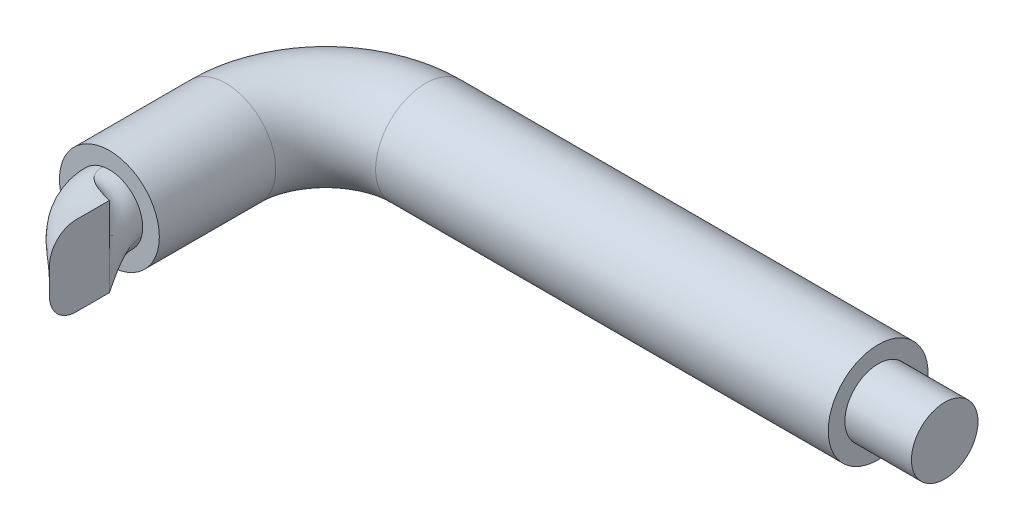
ISO-10303-21;
HEADER;
FILE_DESCRIPTION(('STEP AP214'),'2;1');
FILE_NAME('part.step','',(''),(''),'','','');
FILE_SCHEMA(('AUTOMOTIVE_DESIGN { 1 0 10303 214 1 1 1 1 }'));
ENDSEC;
DATA;
#1=APPLICATION_CONTEXT('core data for automotive mechanical design processes');
#2=APPLICATION_PROTOCOL_DEFINITION('international standard','automotive_design',2000,#1);
#3=PRODUCT_CONTEXT('',#1,'mechanical');
#4=PRODUCT('Part','Part','',(#3));
#5=PRODUCT_RELATED_PRODUCT_CATEGORY('part','',(#4));
#6=PRODUCT_DEFINITION_FORMATION('','',#4);
#7=PRODUCT_DEFINITION_CONTEXT('part definition',#1,'design');
#8=PRODUCT_DEFINITION('design','',#6,#7);
#9=PRODUCT_DEFINITION_SHAPE('','',#8);
#10=(LENGTH_UNIT() NAMED_UNIT(*) SI_UNIT(.MILLI.,.METRE.));
#11=(NAMED_UNIT(*) PLANE_ANGLE_UNIT() SI_UNIT($,.RADIAN.));
#12=(NAMED_UNIT(*) SI_UNIT($,.STERADIAN.) SOLID_ANGLE_UNIT());
#13=UNCERTAINTY_MEASURE_WITH_UNIT(LENGTH_MEASURE(1.E-05),#10,'distance_accuracy_value','');
#14=(GEOMETRIC_REPRESENTATION_CONTEXT(3) GLOBAL_UNCERTAINTY_ASSIGNED_CONTEXT((#13)) GLOBAL_UNIT_ASSIGNED_CONTEXT((#10,
#11,#12)) REPRESENTATION_CONTEXT('',''));
#15=CARTESIAN_POINT('',(0.,0.,0.));
#16=DIRECTION('',(0.,0.,1.));
#17=DIRECTION('',(1.,0.,0.));
#18=AXIS2_PLACEMENT_3D('',#15,#16,#17);
#19=CARTESIAN_POINT('',(0.,0.,0.));
#20=DIRECTION('',(0.,0.,1.));
#21=DIRECTION('',(1.,0.,0.));
#22=AXIS2_PLACEMENT_3D('',#19,#20,#21);
#23=PLANE('',#22);
#24=CARTESIAN_POINT('',(0.,0.,0.));
#25=DIRECTION('',(0.,0.,1.));
#26=DIRECTION('',(1.,0.,0.));
#27=AXIS2_PLACEMENT_3D('',#24,#25,#26);
#28=CIRCLE('',#27,1.5);
#29=CARTESIAN_POINT('',(1.5,0.,0.));
#30=VERTEX_POINT('',#29);
#31=EDGE_CURVE('E327',#30,#30,#28,.T.);
#32=ORIENTED_EDGE('',*,*,#31,.T.);
#33=EDGE_LOOP('',(#32));
#34=FACE_BOUND('',#33,.T.);
#35=CARTESIAN_POINT('',(0.,0.,0.));
#36=DIRECTION('',(0.,0.,1.));
#37=DIRECTION('',(1.,0.,0.));
#38=AXIS2_PLACEMENT_3D('',#35,#36,#37);
#39=CIRCLE('',#38,1.);
#40=CARTESIAN_POINT('',(-0.196014603582893,0.980600976535431,0.));
#41=VERTEX_POINT('',#40);
#42=CARTESIAN_POINT('',(0.968273614060441,-0.249892393470332,0.));
#43=VERTEX_POINT('',#42);
#44=EDGE_CURVE('E222',#41,#43,#39,.T.);
#45=ORIENTED_EDGE('',*,*,#44,.F.);
#46=CARTESIAN_POINT('',(0.968273614060441,-0.249892393470332,0.));
#47=CARTESIAN_POINT('',(0.975401751704675,-0.222277290418172,0.));
#48=CARTESIAN_POINT('',(0.981378344294026,-0.194376502746998,0.));
#49=CARTESIAN_POINT('',(0.990959635482259,-0.13816611327387,0.));
#50=CARTESIAN_POINT('',(0.994563916211097,-0.109856440345965,0.));
#51=CARTESIAN_POINT('',(1.00169674255544,-0.0247533128585314,0.));
#52=CARTESIAN_POINT('',(1.0015913815013,0.0323917667388428,0.));
#53=CARTESIAN_POINT('',(0.991533411556463,0.145179209531626,0.));
#54=CARTESIAN_POINT('',(0.981683812776769,0.200831038692795,0.));
#55=CARTESIAN_POINT('',(0.952647257426055,0.309656022599184,0.));
#56=CARTESIAN_POINT('',(0.933457042564117,0.362828305305481,0.));
#57=CARTESIAN_POINT('',(0.886807600630729,0.464866963932581,0.));
#58=CARTESIAN_POINT('',(0.859417356060065,0.513765027469147,0.));
#59=CARTESIAN_POINT('',(0.796956305830027,0.606389194046122,0.));
#60=CARTESIAN_POINT('',(0.761888118358517,0.650117052323781,0.));
#61=CARTESIAN_POINT('',(0.684302904771817,0.731378232435368,0.));
#62=CARTESIAN_POINT('',(0.641702453889153,0.768831920784329,0.));
#63=CARTESIAN_POINT('',(0.550878231866113,0.836146963445934,0.));
#64=CARTESIAN_POINT('',(0.502652190662811,0.86600523725766,0.));
#65=CARTESIAN_POINT('',(0.401859065984796,0.917389295403562,0.));
#66=CARTESIAN_POINT('',(0.349287000313928,0.938905351065081,0.));
#67=CARTESIAN_POINT('',(0.241244872588478,0.972588469933583,0.));
#68=CARTESIAN_POINT('',(0.185776137831459,0.984759775590992,0.));
#69=CARTESIAN_POINT('',(0.075602212889256,0.999107115314082,0.));
#70=CARTESIAN_POINT('',(0.0209427256883897,1.00163085675871,0.));
#71=CARTESIAN_POINT('',(-0.0607982462033383,0.998715930621456,0.));
#72=CARTESIAN_POINT('',(-0.0880385834828392,0.996620536571416,0.));
#73=CARTESIAN_POINT('',(-0.14225877235282,0.990239633691644,0.));
#74=CARTESIAN_POINT('',(-0.169238654137037,0.985954381908235,0.));
#75=CARTESIAN_POINT('',(-0.196014603582894,0.980600976535431,0.));
#76=B_SPLINE_CURVE_WITH_KNOTS('',3,(#46,#47,#48,#49,#50,#51,#52,#53,#54,#55,#56,#57,#58,#59,#60,
#61,#62,#63,#64,#65,#66,#67,#68,#69,#70,#71,#72,#73,#74,#75),.UNSPECIFIED.,.F.,.F.,(4,2,2,2,2,2,
2,2,2,2,2,2,2,2,4),(0.,0.0855119962023879,0.171039050857386,0.341550072552126,0.510277611785777,
0.679064050542799,0.84646867728225,1.01381630750406,1.18314904021408,1.352550340736,
1.52214860662187,1.69166983049049,1.85502037040864,1.93690562876398,2.018781277604),.UNSPECIFIED.);
#77=EDGE_CURVE('E192',#43,#41,#76,.T.);
#78=ORIENTED_EDGE('',*,*,#77,.F.);
#79=EDGE_LOOP('',(#45,#78));
#80=FACE_BOUND('',#79,.T.);
#81=ADVANCED_FACE('F174',(#34,#80),#23,.T.);
#82=CARTESIAN_POINT('',(16.6,0.,-6.5));
#83=DIRECTION('',(-1.,0.,0.));
#84=DIRECTION('',(0.,0.,1.));
#85=AXIS2_PLACEMENT_3D('',#82,#83,#84);
#86=PLANE('',#85);
#87=CARTESIAN_POINT('',(16.6,0.,-6.5));
#88=DIRECTION('',(1.,0.,0.));
#89=DIRECTION('',(0.,0.,-1.));
#90=AXIS2_PLACEMENT_3D('',#87,#88,#89);
#91=CIRCLE('',#90,1.);
#92=CARTESIAN_POINT('',(16.6,0.,-7.5));
#93=VERTEX_POINT('',#92);
#94=EDGE_CURVE('E12',#93,#93,#91,.T.);
#95=ORIENTED_EDGE('',*,*,#94,.F.);
#96=EDGE_LOOP('',(#95));
#97=FACE_BOUND('',#96,.T.);
#98=CARTESIAN_POINT('',(16.6,0.,-6.5));
#99=DIRECTION('',(-1.,0.,0.));
#100=DIRECTION('',(0.,0.,1.));
#101=AXIS2_PLACEMENT_3D('',#98,#99,#100);
#102=CIRCLE('',#101,1.5);
#103=CARTESIAN_POINT('',(16.6,0.,-5.));
#104=VERTEX_POINT('',#103);
#105=EDGE_CURVE('E184',#104,#104,#102,.T.);
#106=ORIENTED_EDGE('',*,*,#105,.F.);
#107=EDGE_LOOP('',(#106));
#108=FACE_BOUND('',#107,.T.);
#109=ADVANCED_FACE('F392',(#97,#108),#86,.F.);
#110=CARTESIAN_POINT('',(0.,0.,0.));
#111=DIRECTION('',(0.,0.,-1.));
#112=DIRECTION('',(-1.,0.,0.));
#113=AXIS2_PLACEMENT_3D('',#110,#111,#112);
#114=CYLINDRICAL_SURFACE('',#113,1.5);
#115=CARTESIAN_POINT('',(0.,0.,-3.5));
#116=DIRECTION('',(0.,0.,1.));
#117=DIRECTION('',(1.,0.,0.));
#118=AXIS2_PLACEMENT_3D('',#115,#116,#117);
#119=CIRCLE('',#118,1.5);
#120=CARTESIAN_POINT('',(-1.5,0.,-3.5));
#121=VERTEX_POINT('',#120);
#122=EDGE_CURVE('E377',#121,#121,#119,.T.);
#123=ORIENTED_EDGE('',*,*,#122,.T.);
#124=EDGE_LOOP('',(#123));
#125=FACE_BOUND('',#124,.T.);
#126=ORIENTED_EDGE('',*,*,#31,.F.);
#127=EDGE_LOOP('',(#126));
#128=FACE_BOUND('',#127,.T.);
#129=ADVANCED_FACE('F394',(#125,#128),#114,.T.);
#130=CARTESIAN_POINT('',(3.,0.,-3.5));
#131=DIRECTION('',(0.,-1.,0.));
#132=DIRECTION('',(0.,0.,-1.));
#133=AXIS2_PLACEMENT_3D('',#130,#131,#132);
#134=TOROIDAL_SURFACE('',#133,3.,1.5);
#135=CARTESIAN_POINT('',(3.,0.,-6.5));
#136=DIRECTION('',(-1.,0.,0.));
#137=DIRECTION('',(0.,0.,1.));
#138=AXIS2_PLACEMENT_3D('',#135,#136,#137);
#139=CIRCLE('',#138,1.5);
#140=CARTESIAN_POINT('',(3.,0.,-8.));
#141=VERTEX_POINT('',#140);
#142=EDGE_CURVE('E380',#141,#141,#139,.T.);
#143=CARTESIAN_POINT('',(3.,0.,-3.5));
#144=DIRECTION('',(0.,-1.,0.));
#145=DIRECTION('',(0.,0.,-1.));
#146=AXIS2_PLACEMENT_3D('',#143,#144,#145);
#147=CIRCLE('',#146,4.5);
#148=EDGE_CURVE('',#121,#141,#147,.T.);
#149=ORIENTED_EDGE('',*,*,#122,.F.);
#150=ORIENTED_EDGE('',*,*,#142,.T.);
#151=ORIENTED_EDGE('',*,*,#148,.T.);
#152=ORIENTED_EDGE('',*,*,#148,.F.);
#153=EDGE_LOOP('',(#149,#151,#150,#152));
#154=FACE_BOUND('',#153,.T.);
#155=ADVANCED_FACE('F400',(#154),#134,.T.);
#156=CARTESIAN_POINT('',(3.,0.,-6.5));
#157=DIRECTION('',(1.,0.,0.));
#158=DIRECTION('',(0.,0.,-1.));
#159=AXIS2_PLACEMENT_3D('',#156,#157,#158);
#160=CYLINDRICAL_SURFACE('',#159,1.5);
#161=ORIENTED_EDGE('',*,*,#105,.T.);
#162=EDGE_LOOP('',(#161));
#163=FACE_BOUND('',#162,.T.);
#164=ORIENTED_EDGE('',*,*,#142,.F.);
#165=EDGE_LOOP('',(#164));
#166=FACE_BOUND('',#165,.T.);
#167=ADVANCED_FACE('F389',(#163,#166),#160,.T.);
#168=CARTESIAN_POINT('',(1.,-0.400000000000001,2.));
#169=DIRECTION('',(-1.,0.,0.));
#170=DIRECTION('',(0.,0.,1.));
#171=AXIS2_PLACEMENT_3D('',#168,#169,#170);
#172=PLANE('',#171);
#173=CARTESIAN_POINT('',(1.,-0.400000000000001,2.));
#174=DIRECTION('',(1.,0.,0.));
#175=DIRECTION('',(0.,0.,1.));
#176=AXIS2_PLACEMENT_3D('',#173,#174,#175);
#177=CIRCLE('',#176,0.8);
#178=CARTESIAN_POINT('',(1.,-0.399999999999995,2.8));
#179=VERTEX_POINT('',#178);
#180=CARTESIAN_POINT('',(1.,-1.2,1.99999999999999));
#181=VERTEX_POINT('',#180);
#182=EDGE_CURVE('E235',#179,#181,#177,.T.);
#183=ORIENTED_EDGE('',*,*,#182,.T.);
#184=DIRECTION('',(0.,0.,-1.));
#185=VECTOR('',#184,1.);
#186=CARTESIAN_POINT('',(1.,-1.2,0.999999999999997));
#187=LINE('',#186,#185);
#188=CARTESIAN_POINT('',(1.,-1.2,0.999999999999997));
#189=VERTEX_POINT('',#188);
#190=EDGE_CURVE('E323',#181,#189,#187,.T.);
#191=ORIENTED_EDGE('',*,*,#190,.T.);
#192=DIRECTION('',(0.,1.,0.));
#193=VECTOR('',#192,1.);
#194=CARTESIAN_POINT('',(1.,1.2,0.999999999999997));
#195=LINE('',#194,#193);
#196=CARTESIAN_POINT('',(1.,1.2,0.999999999999997));
#197=VERTEX_POINT('',#196);
#198=EDGE_CURVE('E232',#189,#197,#195,.T.);
#199=ORIENTED_EDGE('',*,*,#198,.T.);
#200=DIRECTION('',(0.,0.,1.));
#201=VECTOR('',#200,1.);
#202=CARTESIAN_POINT('',(1.,1.2,1.99999999999999));
#203=LINE('',#202,#201);
#204=CARTESIAN_POINT('',(1.,1.2,1.99999999999999));
#205=VERTEX_POINT('',#204);
#206=EDGE_CURVE('E282',#197,#205,#203,.T.);
#207=ORIENTED_EDGE('',*,*,#206,.T.);
#208=CARTESIAN_POINT('',(1.,0.399999999999999,2.));
#209=DIRECTION('',(1.,0.,0.));
#210=DIRECTION('',(0.,0.,1.));
#211=AXIS2_PLACEMENT_3D('',#208,#209,#210);
#212=CIRCLE('',#211,0.8);
#213=CARTESIAN_POINT('',(1.,0.399999999999994,2.8));
#214=VERTEX_POINT('',#213);
#215=EDGE_CURVE('E292',#205,#214,#212,.T.);
#216=ORIENTED_EDGE('',*,*,#215,.T.);
#217=DIRECTION('',(0.,-1.,0.));
#218=VECTOR('',#217,1.);
#219=CARTESIAN_POINT('',(1.,0.399999999999994,2.8));
#220=LINE('',#219,#218);
#221=EDGE_CURVE('E200',#214,#179,#220,.T.);
#222=ORIENTED_EDGE('',*,*,#221,.T.);
#223=EDGE_LOOP('',(#183,#191,#199,#207,#216,#222));
#224=FACE_BOUND('',#223,.T.);
#225=ADVANCED_FACE('F261',(#224),#172,.F.);
#226=CARTESIAN_POINT('',(-0.196014603582893,0.980600976535431,0.));
#227=CARTESIAN_POINT('',(-0.196014603582893,0.980600976535431,0.524784279858638));
#228=CARTESIAN_POINT('',(0.401992698208553,1.09030048826772,0.762392139929317));
#229=CARTESIAN_POINT('',(1.,1.2,0.999999999999997));
#230=CARTESIAN_POINT('',(-0.264815251774087,0.966848255393861,0.));
#231=CARTESIAN_POINT('',(-0.264815251774087,0.966848255393861,0.560532785170984));
#232=CARTESIAN_POINT('',(0.367592374112956,1.08342412769693,0.821933059252157));
#233=CARTESIAN_POINT('',(1.,1.2,1.08333333333333));
#234=CARTESIAN_POINT('',(-0.400523374754056,0.924557712118684,0.));
#235=CARTESIAN_POINT('',(-0.400523374754056,0.924557712118684,0.632029795795677));
#236=CARTESIAN_POINT('',(0.299738312622972,1.06227885605934,0.940431297980671));
#237=CARTESIAN_POINT('',(1.,1.2,1.24883280016567));
#238=CARTESIAN_POINT('',(-0.586736883420875,0.819085761681485,0.));
#239=CARTESIAN_POINT('',(-0.586736883420875,0.819085761681485,0.737809447339111));
#240=CARTESIAN_POINT('',(0.206631558289562,1.00954288084074,1.11701410362011));
#241=CARTESIAN_POINT('',(1.,1.2,1.49621875990111));
#242=CARTESIAN_POINT('',(-0.745275109499436,0.677740188311074,0.));
#243=CARTESIAN_POINT('',(-0.745275109499436,0.677740188311074,0.840446233919579));
#244=CARTESIAN_POINT('',(0.127362445250283,0.938870094155537,1.29286417881078));
#245=CARTESIAN_POINT('',(1.,1.2,1.74528212370198));
#246=CARTESIAN_POINT('',(-0.827450772978966,0.565663521657405,0.));
#247=CARTESIAN_POINT('',(-0.827450772978966,0.565663521657405,0.907375418013078));
#248=CARTESIAN_POINT('',(0.0862746135105171,0.882831760828702,1.41081136092001));
#249=CARTESIAN_POINT('',(1.,1.2,1.91424730382694));
#250=CARTESIAN_POINT('',(-0.903250214631539,0.436757171221151,0.));
#251=CARTESIAN_POINT('',(-0.903250214631539,0.436757171221151,0.97828684762892));
#252=CARTESIAN_POINT('',(0.0483748926842304,0.818378585610576,1.54029361962161));
#253=CARTESIAN_POINT('',(1.,1.2,2.10230039161431));
#254=CARTESIAN_POINT('',(-0.967120214930955,0.289060536947368,0.));
#255=CARTESIAN_POINT('',(-0.967120214930955,0.289060536947368,1.0522251607541));
#256=CARTESIAN_POINT('',(0.016439892534522,0.72458941989801,1.6813243768706));
#257=CARTESIAN_POINT('',(0.999999999999999,1.16011830284865,2.3104235929871));
#258=CARTESIAN_POINT('',(-1.00770924018175,0.0553883695553476,0.));
#259=CARTESIAN_POINT('',(-1.00770924018175,0.0553883695553476,1.13218266571382));
#260=CARTESIAN_POINT('',(-0.00385462009087308,0.518315588843089,1.85634742913119));
#261=CARTESIAN_POINT('',(1.,0.981242808130831,2.58051219254856));
#262=CARTESIAN_POINT('',(-0.992983876327313,-0.181117586707804,0.));
#263=CARTESIAN_POINT('',(-0.992983876327313,-0.181117586707804,1.17340772003749));
#264=CARTESIAN_POINT('',(0.00350806183634328,0.265025655283169,1.96664672707173));
#265=CARTESIAN_POINT('',(1.,0.711168897274142,2.75988573410597));
#266=CARTESIAN_POINT('',(-0.945835328266532,-0.334626623377778,0.));
#267=CARTESIAN_POINT('',(-0.945835328266532,-0.334626623377778,1.16901585394414));
#268=CARTESIAN_POINT('',(0.0270823358667341,0.0839817045244535,1.98450792697207));
#269=CARTESIAN_POINT('',(1.,0.502590032426686,2.8));
#270=CARTESIAN_POINT('',(-0.890458758043213,-0.45830335315342,0.));
#271=CARTESIAN_POINT('',(-0.890458758043213,-0.45830335315342,1.15730363345784));
#272=CARTESIAN_POINT('',(0.0547706209783933,-0.0635498709227759,1.97865181672892));
#273=CARTESIAN_POINT('',(1.,0.331203611307868,2.8));
#274=CARTESIAN_POINT('',(-0.836820347133841,-0.556217761158854,0.));
#275=CARTESIAN_POINT('',(-0.836820347133841,-0.556217761158854,1.14357032799312));
#276=CARTESIAN_POINT('',(0.0815898264330793,-0.179633089504546,1.97178516399656));
#277=CARTESIAN_POINT('',(1.,0.196951582149762,2.8));
#278=CARTESIAN_POINT('',(-0.729973177416501,-0.69068561225608,0.));
#279=CARTESIAN_POINT('',(-0.7299731774165,-0.69068561225608,1.12100429409225));
#280=CARTESIAN_POINT('',(0.13501341129175,-0.34534280612804,1.96050214704612));
#281=CARTESIAN_POINT('',(1.,0.,2.8));
#282=CARTESIAN_POINT('',(-0.601616245373538,-0.804801848493568,0.));
#283=CARTESIAN_POINT('',(-0.601616245373538,-0.804801848493568,1.09336149814611));
#284=CARTESIAN_POINT('',(0.199191877313231,-0.500876715321666,1.94668074907306));
#285=CARTESIAN_POINT('',(1.,-0.196951582149764,2.8));
#286=CARTESIAN_POINT('',(-0.506800262309973,-0.863777898194943,0.));
#287=CARTESIAN_POINT('',(-0.506800262309973,-0.863777898194943,1.07538721390739));
#288=CARTESIAN_POINT('',(0.246599868845014,-0.597490754751406,1.9376936069537));
#289=CARTESIAN_POINT('',(1.,-0.331203611307869,2.8));
#290=CARTESIAN_POINT('',(-0.386371932857743,-0.925902897052409,0.));
#291=CARTESIAN_POINT('',(-0.386371932857743,-0.925902897052409,1.04924021472312));
#292=CARTESIAN_POINT('',(0.306814033571129,-0.714246464739545,1.92462010736156));
#293=CARTESIAN_POINT('',(1.,-0.502590032426681,2.8));
#294=CARTESIAN_POINT('',(-0.235702272441934,-0.981460644970844,0.));
#295=CARTESIAN_POINT('',(-0.235702272441934,-0.981460644970844,1.01122843109486));
#296=CARTESIAN_POINT('',(0.382148863779033,-0.846314771122491,1.88555708260042));
#297=CARTESIAN_POINT('',(1.,-0.711168897274138,2.75988573410597));
#298=CARTESIAN_POINT('',(-0.00037111401042278,-1.00923022472777,0.));
#299=CARTESIAN_POINT('',(-0.00037111401042278,-1.00923022472777,0.920987921069522));
#300=CARTESIAN_POINT('',(0.499814442994788,-0.9952365164293,1.75075005680904));
#301=CARTESIAN_POINT('',(0.999999999999999,-0.981242808130831,2.58051219254856));
#302=CARTESIAN_POINT('',(0.235186646125404,-0.981613338149335,0.));
#303=CARTESIAN_POINT('',(0.235186646125404,-0.981613338149335,0.812291590556917));
#304=CARTESIAN_POINT('',(0.617593323062703,-1.07086582049899,1.56135759177201));
#305=CARTESIAN_POINT('',(1.,-1.16011830284865,2.3104235929871));
#306=CARTESIAN_POINT('',(0.386186440893678,-0.926000977167355,0.));
#307=CARTESIAN_POINT('',(0.386186440893678,-0.926000977167355,0.735115824758113));
#308=CARTESIAN_POINT('',(0.693093220446839,-1.06300048858368,1.41870810818621));
#309=CARTESIAN_POINT('',(1.,-1.2,2.10230039161431));
#310=CARTESIAN_POINT('',(0.51908374110282,-0.857439252168948,0.));
#311=CARTESIAN_POINT('',(0.51908374110282,-0.857439252168948,0.667664693971993));
#312=CARTESIAN_POINT('',(0.75954187055141,-1.02871962608447,1.29095599889947));
#313=CARTESIAN_POINT('',(1.,-1.2,1.91424730382694));
#314=CARTESIAN_POINT('',(0.635538889074308,-0.78157341685002,0.));
#315=CARTESIAN_POINT('',(0.635538889074308,-0.78157341685002,0.608811465929802));
#316=CARTESIAN_POINT('',(0.817769444537154,-0.99078670842501,1.17704679481589));
#317=CARTESIAN_POINT('',(1.,-1.2,1.74528212370198));
#318=CARTESIAN_POINT('',(0.785407698340686,-0.631104733013564,0.));
#319=CARTESIAN_POINT('',(0.785407698340685,-0.631104733013564,0.536263209984641));
#320=CARTESIAN_POINT('',(0.892703849170342,-0.915552366506782,1.01624098494288));
#321=CARTESIAN_POINT('',(1.,-1.2,1.49621875990111));
#322=CARTESIAN_POINT('',(0.901016841625699,-0.450996568417897,0.));
#323=CARTESIAN_POINT('',(0.901016841625699,-0.450996568417897,0.481766783952601));
#324=CARTESIAN_POINT('',(0.95050842081285,-0.825498284208948,0.865299792059133));
#325=CARTESIAN_POINT('',(1.,-1.2,1.24883280016566));
#326=CARTESIAN_POINT('',(0.950740734672995,-0.317828132744381,0.));
#327=CARTESIAN_POINT('',(0.950740734672995,-0.317828132744381,0.467200116810694));
#328=CARTESIAN_POINT('',(0.975370367336498,-0.75891406637219,0.775266725072012));
#329=CARTESIAN_POINT('',(1.,-1.2,1.08333333333333));
#330=CARTESIAN_POINT('',(0.968273614060441,-0.249892393470332,0.));
#331=CARTESIAN_POINT('',(0.968273614060441,-0.249892393470332,0.45991678323974));
#332=CARTESIAN_POINT('',(0.984136807030221,-0.724946196735166,0.729958391619869));
#333=CARTESIAN_POINT('',(1.,-1.2,0.999999999999997));
#334=B_SPLINE_SURFACE_WITH_KNOTS('',3,3,((#226,#227,#228,#229),(#230,#231,#232,#233),(#234,#235,
#236,#237),(#238,#239,#240,#241),(#242,#243,#244,#245),(#246,#247,#248,#249),(#250,#251,#252,
#253),(#254,#255,#256,#257),(#258,#259,#260,#261),(#262,#263,#264,#265),(#266,#267,#268,#269),
(#270,#271,#272,#273),(#274,#275,#276,#277),(#278,#279,#280,#281),(#282,#283,#284,#285),(#286,
#287,#288,#289),(#290,#291,#292,#293),(#294,#295,#296,#297),(#298,#299,#300,#301),(#302,#303,
#304,#305),(#306,#307,#308,#309),(#310,#311,#312,#313),(#314,#315,#316,#317),(#318,#319,#320,
#321),(#322,#323,#324,#325),(#326,#327,#328,#329),(#330,#331,#332,#333)),.UNSPECIFIED.,.F.,.F.,
.F.,(4,1,1,1,2,1,1,1,2,1,1,1,2,1,1,1,2,1,1,1,4),(4,4),(0.,0.0482072684762463,0.0964145369524927,
0.144621805428739,0.192829073904985,0.250338898038241,0.307848722171496,0.365358546304751,
0.422868370438007,0.461434185219003,0.5,0.538565814780996,0.577131629561993,0.634641453695248,
0.692151277828504,0.749661101961759,0.807170926095015,0.855378194571261,0.903585463047508,
0.951792731523754,1.),(0.,1.),.UNSPECIFIED.);
#335=CARTESIAN_POINT('',(0.968273614060441,-0.249892393470332,0.));
#336=CARTESIAN_POINT('',(0.968273614060441,-0.249892393470332,0.45991678323974));
#337=CARTESIAN_POINT('',(0.984136807030221,-0.724946196735166,0.729958391619869));
#338=CARTESIAN_POINT('',(1.,-1.2,0.999999999999997));
#339=B_SPLINE_CURVE_WITH_KNOTS('',3,(#335,#336,#337,#338),.UNSPECIFIED.,.F.,.F.,(4,4),(0.,1.),.UNSPECIFIED.);
#340=EDGE_CURVE('E224',#43,#189,#339,.T.);
#341=CARTESIAN_POINT('',(-0.196014603582893,0.980600976535431,0.));
#342=CARTESIAN_POINT('',(-0.196014603582893,0.980600976535431,0.524784279858638));
#343=CARTESIAN_POINT('',(0.401992698208553,1.09030048826772,0.762392139929317));
#344=CARTESIAN_POINT('',(1.,1.2,0.999999999999997));
#345=B_SPLINE_CURVE_WITH_KNOTS('',3,(#341,#342,#343,#344),.UNSPECIFIED.,.F.,.F.,(4,4),(0.,1.),.UNSPECIFIED.);
#346=EDGE_CURVE('E226',#197,#41,#345,.F.);
#347=ORIENTED_EDGE('',*,*,#44,.T.);
#348=ORIENTED_EDGE('',*,*,#340,.T.);
#349=ORIENTED_EDGE('',*,*,#190,.F.);
#350=ORIENTED_EDGE('',*,*,#182,.F.);
#351=ORIENTED_EDGE('',*,*,#221,.F.);
#352=ORIENTED_EDGE('',*,*,#215,.F.);
#353=ORIENTED_EDGE('',*,*,#206,.F.);
#354=ORIENTED_EDGE('',*,*,#346,.T.);
#355=EDGE_LOOP('',(#347,#348,#349,#350,#351,#352,#353,#354));
#356=FACE_BOUND('',#355,.T.);
#357=ADVANCED_FACE('F223',(#356),#334,.T.);
#358=CARTESIAN_POINT('',(0.968273614060441,-0.249892393470332,0.));
#359=CARTESIAN_POINT('',(0.968273614060441,-0.249892393470332,0.45991678323974));
#360=CARTESIAN_POINT('',(0.984136807030221,-0.724946196735166,0.729958391619869));
#361=CARTESIAN_POINT('',(1.,-1.2,0.999999999999997));
#362=CARTESIAN_POINT('',(1.01126575851969,-0.0833080548529602,0.));
#363=CARTESIAN_POINT('',(1.01126575851969,-0.0833080548529603,0.452669701851927));
#364=CARTESIAN_POINT('',(1.00563287925985,-0.54165402742648,0.726334850925962));
#365=CARTESIAN_POINT('',(1.,-1.,0.999999999999997));
#366=CARTESIAN_POINT('',(1.0105000931044,0.258269771718381,0.));
#367=CARTESIAN_POINT('',(1.0105000931044,0.258269771718381,0.4381755390763));
#368=CARTESIAN_POINT('',(1.0052500465522,-0.17086511414081,0.719087769538149));
#369=CARTESIAN_POINT('',(1.,-0.6,0.999999999999998));
#370=CARTESIAN_POINT('',(0.758515346963145,0.717704380127379,0.));
#371=CARTESIAN_POINT('',(0.758515346963145,0.717704380127378,0.412293662468785));
#372=CARTESIAN_POINT('',(0.879257673481572,0.358852190063689,0.70614683123439));
#373=CARTESIAN_POINT('',(0.999999999999999,0.,0.999999999999996));
#374=CARTESIAN_POINT('',(0.313704368670268,0.994687529943276,0.));
#375=CARTESIAN_POINT('',(0.313704368670268,0.994687529943276,0.400415649539725));
#376=CARTESIAN_POINT('',(0.656852184335134,0.797343764971638,0.700207824769861));
#377=CARTESIAN_POINT('',(1.,0.6,0.999999999999997));
#378=CARTESIAN_POINT('',(-0.0273094331107929,1.01432384435197,0.));
#379=CARTESIAN_POINT('',(-0.0273094331107929,1.01432384435197,0.483328069752334));
#380=CARTESIAN_POINT('',(0.486345283444604,1.00716192217598,0.741664034876165));
#381=CARTESIAN_POINT('',(1.,1.,0.999999999999997));
#382=CARTESIAN_POINT('',(-0.196014603582894,0.980600976535431,0.));
#383=CARTESIAN_POINT('',(-0.196014603582894,0.980600976535431,0.524784279858639));
#384=CARTESIAN_POINT('',(0.401992698208553,1.09030048826772,0.762392139929318));
#385=CARTESIAN_POINT('',(1.,1.2,0.999999999999997));
#386=B_SPLINE_SURFACE_WITH_KNOTS('',3,3,((#358,#359,#360,#361),(#362,#363,#364,#365),(#366,#367,
#368,#369),(#370,#371,#372,#373),(#374,#375,#376,#377),(#378,#379,#380,#381),(#382,#383,#384,
#385)),.UNSPECIFIED.,.F.,.F.,.F.,(4,1,1,1,4),(4,4),(0.,0.25,0.5,0.75,1.),(0.,1.),.UNSPECIFIED.);
#387=ORIENTED_EDGE('',*,*,#77,.T.);
#388=ORIENTED_EDGE('',*,*,#346,.F.);
#389=ORIENTED_EDGE('',*,*,#198,.F.);
#390=ORIENTED_EDGE('',*,*,#340,.F.);
#391=EDGE_LOOP('',(#387,#388,#389,#390));
#392=FACE_BOUND('',#391,.T.);
#393=ADVANCED_FACE('F231',(#392),#386,.T.);
#394=CARTESIAN_POINT('',(18.6,0.,-6.5));
#395=DIRECTION('',(-1.,0.,0.));
#396=DIRECTION('',(0.,0.,1.));
#397=AXIS2_PLACEMENT_3D('',#394,#395,#396);
#398=CYLINDRICAL_SURFACE('',#397,1.);
#399=CARTESIAN_POINT('',(18.6,0.,-6.5));
#400=DIRECTION('',(1.,0.,0.));
#401=DIRECTION('',(0.,0.,-1.));
#402=AXIS2_PLACEMENT_3D('',#399,#400,#401);
#403=CIRCLE('',#402,1.);
#404=CARTESIAN_POINT('',(18.6,0.,-7.5));
#405=VERTEX_POINT('',#404);
#406=EDGE_CURVE('E229',#405,#405,#403,.T.);
#407=ORIENTED_EDGE('',*,*,#406,.F.);
#408=EDGE_LOOP('',(#407));
#409=FACE_BOUND('',#408,.T.);
#410=ORIENTED_EDGE('',*,*,#94,.T.);
#411=EDGE_LOOP('',(#410));
#412=FACE_BOUND('',#411,.T.);
#413=ADVANCED_FACE('F256',(#409,#412),#398,.T.);
#414=CARTESIAN_POINT('',(18.6,0.,-6.5));
#415=DIRECTION('',(1.,0.,0.));
#416=DIRECTION('',(0.,0.,-1.));
#417=AXIS2_PLACEMENT_3D('',#414,#415,#416);
#418=PLANE('',#417);
#419=ORIENTED_EDGE('',*,*,#406,.T.);
#420=EDGE_LOOP('',(#419));
#421=FACE_BOUND('',#420,.T.);
#422=ADVANCED_FACE('F474',(#421),#418,.T.);
#423=CLOSED_SHELL('',(#81,#109,#129,#155,#167,#225,#357,#393,#413,#422));
#424=MANIFOLD_SOLID_BREP('B2',#423);
#425=ADVANCED_BREP_SHAPE_REPRESENTATION('',(#18,#424),#14);
#426=SHAPE_DEFINITION_REPRESENTATION(#9,#425);
ENDSEC;
END-ISO-10303-21;
